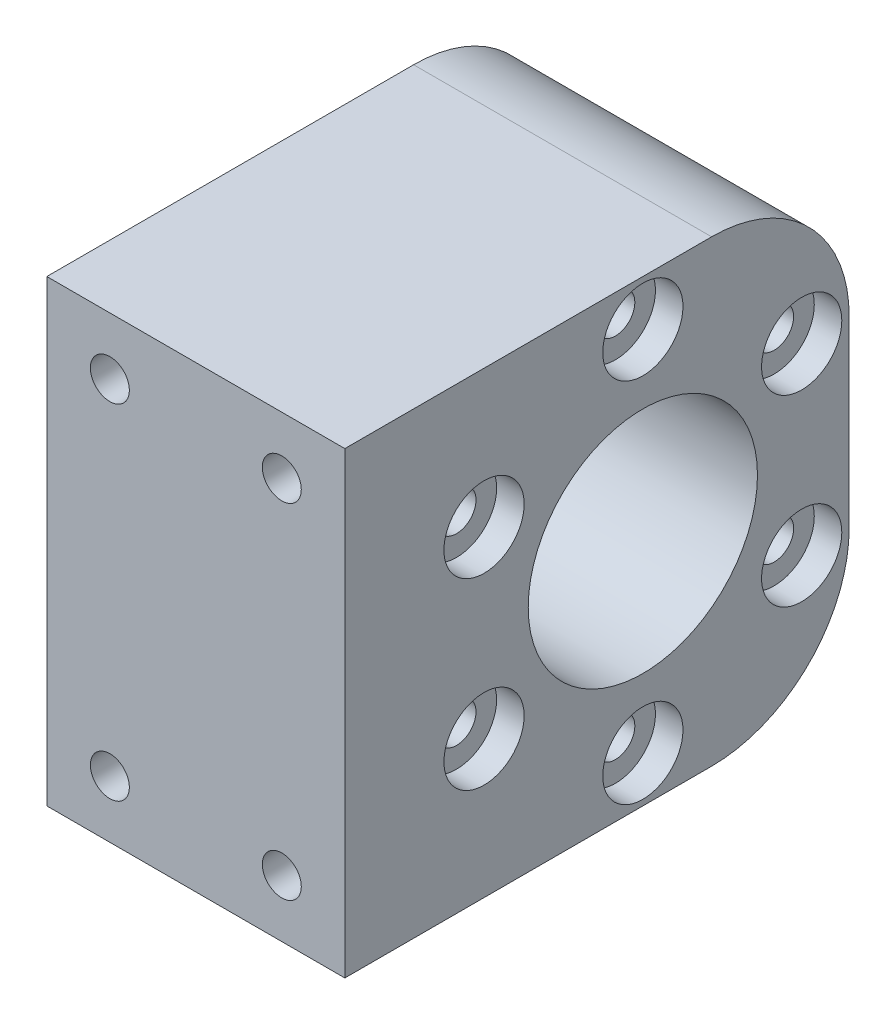
ISO-10303-21;
HEADER;
FILE_DESCRIPTION(('STEP AP214'),'2;1');
FILE_NAME('part.step','',(''),(''),'','','');
FILE_SCHEMA(('AUTOMOTIVE_DESIGN { 1 0 10303 214 1 1 1 1 }'));
ENDSEC;
DATA;
#1=APPLICATION_CONTEXT('core data for automotive mechanical design processes');
#2=APPLICATION_PROTOCOL_DEFINITION('international standard','automotive_design',2000,#1);
#3=PRODUCT_CONTEXT('',#1,'mechanical');
#4=PRODUCT('Part','Part','',(#3));
#5=PRODUCT_RELATED_PRODUCT_CATEGORY('part','',(#4));
#6=PRODUCT_DEFINITION_FORMATION('','',#4);
#7=PRODUCT_DEFINITION_CONTEXT('part definition',#1,'design');
#8=PRODUCT_DEFINITION('design','',#6,#7);
#9=PRODUCT_DEFINITION_SHAPE('','',#8);
#10=(LENGTH_UNIT() NAMED_UNIT(*) SI_UNIT(.MILLI.,.METRE.));
#11=(NAMED_UNIT(*) PLANE_ANGLE_UNIT() SI_UNIT($,.RADIAN.));
#12=(NAMED_UNIT(*) SI_UNIT($,.STERADIAN.) SOLID_ANGLE_UNIT());
#13=UNCERTAINTY_MEASURE_WITH_UNIT(LENGTH_MEASURE(1.E-05),#10,'distance_accuracy_value','');
#14=(GEOMETRIC_REPRESENTATION_CONTEXT(3) GLOBAL_UNCERTAINTY_ASSIGNED_CONTEXT((#13)) GLOBAL_UNIT_ASSIGNED_CONTEXT((#10,
#11,#12)) REPRESENTATION_CONTEXT('',''));
#15=CARTESIAN_POINT('',(0.,0.,0.));
#16=DIRECTION('',(0.,0.,1.));
#17=DIRECTION('',(1.,0.,0.));
#18=AXIS2_PLACEMENT_3D('',#15,#16,#17);
#19=CARTESIAN_POINT('',(13.,-20.,26.));
#20=DIRECTION('',(-1.,0.,0.));
#21=DIRECTION('',(0.,0.,1.));
#22=AXIS2_PLACEMENT_3D('',#19,#20,#21);
#23=PLANE('',#22);
#24=CARTESIAN_POINT('',(13.,0.,0.));
#25=DIRECTION('',(-1.,0.,0.));
#26=DIRECTION('',(0.,0.,1.));
#27=AXIS2_PLACEMENT_3D('',#24,#25,#26);
#28=CIRCLE('',#27,10.);
#29=CARTESIAN_POINT('',(13.,0.,10.));
#30=VERTEX_POINT('',#29);
#31=EDGE_CURVE('E186',#30,#30,#28,.T.);
#32=ORIENTED_EDGE('',*,*,#31,.T.);
#33=EDGE_LOOP('',(#32));
#34=FACE_BOUND('',#33,.T.);
#35=CARTESIAN_POINT('',(13.,16.,0.));
#36=DIRECTION('',(1.,0.,0.));
#37=DIRECTION('',(0.,0.,-1.));
#38=AXIS2_PLACEMENT_3D('',#35,#36,#37);
#39=CIRCLE('',#38,3.5);
#40=CARTESIAN_POINT('',(13.,16.,-3.5));
#41=VERTEX_POINT('',#40);
#42=EDGE_CURVE('E189',#41,#41,#39,.T.);
#43=ORIENTED_EDGE('',*,*,#42,.F.);
#44=EDGE_LOOP('',(#43));
#45=FACE_BOUND('',#44,.T.);
#46=CARTESIAN_POINT('',(13.,8.00000000000059,-13.8564064605514));
#47=DIRECTION('',(1.,0.,0.));
#48=DIRECTION('',(0.,0.,-1.));
#49=AXIS2_PLACEMENT_3D('',#46,#47,#48);
#50=CIRCLE('',#49,3.5);
#51=CARTESIAN_POINT('',(13.,8.00000000000059,-17.3564064605514));
#52=VERTEX_POINT('',#51);
#53=EDGE_CURVE('E203',#52,#52,#50,.T.);
#54=ORIENTED_EDGE('',*,*,#53,.F.);
#55=EDGE_LOOP('',(#54));
#56=FACE_BOUND('',#55,.T.);
#57=CARTESIAN_POINT('',(13.,-7.99999999999941,-13.856406460552));
#58=DIRECTION('',(1.,0.,0.));
#59=DIRECTION('',(0.,0.,-1.));
#60=AXIS2_PLACEMENT_3D('',#57,#58,#59);
#61=CIRCLE('',#60,3.5);
#62=CARTESIAN_POINT('',(13.,-7.99999999999941,-17.356406460552));
#63=VERTEX_POINT('',#62);
#64=EDGE_CURVE('E215',#63,#63,#61,.T.);
#65=ORIENTED_EDGE('',*,*,#64,.F.);
#66=EDGE_LOOP('',(#65));
#67=FACE_BOUND('',#66,.T.);
#68=CARTESIAN_POINT('',(13.,-16.,-1.35836374802349E-12));
#69=DIRECTION('',(1.,0.,0.));
#70=DIRECTION('',(0.,0.,-1.));
#71=AXIS2_PLACEMENT_3D('',#68,#69,#70);
#72=CIRCLE('',#71,3.5);
#73=CARTESIAN_POINT('',(13.,-16.,-3.50000000000135));
#74=VERTEX_POINT('',#73);
#75=EDGE_CURVE('E227',#74,#74,#72,.T.);
#76=ORIENTED_EDGE('',*,*,#75,.F.);
#77=EDGE_LOOP('',(#76));
#78=FACE_BOUND('',#77,.T.);
#79=CARTESIAN_POINT('',(13.,-8.0000000000006,13.85640646055));
#80=DIRECTION('',(1.,0.,0.));
#81=DIRECTION('',(0.,0.,-1.));
#82=AXIS2_PLACEMENT_3D('',#79,#80,#81);
#83=CIRCLE('',#82,3.5);
#84=CARTESIAN_POINT('',(13.,-8.0000000000006,10.35640646055));
#85=VERTEX_POINT('',#84);
#86=EDGE_CURVE('E239',#85,#85,#83,.T.);
#87=ORIENTED_EDGE('',*,*,#86,.F.);
#88=EDGE_LOOP('',(#87));
#89=FACE_BOUND('',#88,.T.);
#90=CARTESIAN_POINT('',(13.,7.99999999999941,13.8564064605507));
#91=DIRECTION('',(1.,0.,0.));
#92=DIRECTION('',(0.,0.,-1.));
#93=AXIS2_PLACEMENT_3D('',#90,#91,#92);
#94=CIRCLE('',#93,3.5);
#95=CARTESIAN_POINT('',(13.,7.99999999999941,10.3564064605507));
#96=VERTEX_POINT('',#95);
#97=EDGE_CURVE('E251',#96,#96,#94,.T.);
#98=ORIENTED_EDGE('',*,*,#97,.F.);
#99=EDGE_LOOP('',(#98));
#100=FACE_BOUND('',#99,.T.);
#101=DIRECTION('',(0.,0.,-1.));
#102=VECTOR('',#101,1.);
#103=CARTESIAN_POINT('',(13.,-20.,26.));
#104=LINE('',#103,#102);
#105=CARTESIAN_POINT('',(13.,-20.,26.));
#106=VERTEX_POINT('',#105);
#107=CARTESIAN_POINT('',(13.,-20.,-5.99999999999999));
#108=VERTEX_POINT('',#107);
#109=EDGE_CURVE('E141',#106,#108,#104,.T.);
#110=ORIENTED_EDGE('',*,*,#109,.T.);
#111=CARTESIAN_POINT('',(13.,-8.,-6.));
#112=DIRECTION('',(-1.,0.,0.));
#113=DIRECTION('',(0.,0.,1.));
#114=AXIS2_PLACEMENT_3D('',#111,#112,#113);
#115=CIRCLE('',#114,12.);
#116=CARTESIAN_POINT('',(13.,-8.,-18.));
#117=VERTEX_POINT('',#116);
#118=EDGE_CURVE('E156',#108,#117,#115,.F.);
#119=ORIENTED_EDGE('',*,*,#118,.T.);
#120=DIRECTION('',(0.,-1.,0.));
#121=VECTOR('',#120,1.);
#122=CARTESIAN_POINT('',(13.,20.,-18.));
#123=LINE('',#122,#121);
#124=CARTESIAN_POINT('',(13.,8.,-18.));
#125=VERTEX_POINT('',#124);
#126=EDGE_CURVE('E178',#125,#117,#123,.T.);
#127=ORIENTED_EDGE('',*,*,#126,.F.);
#128=CARTESIAN_POINT('',(13.,8.,-6.));
#129=DIRECTION('',(-1.,0.,0.));
#130=DIRECTION('',(0.,0.,1.));
#131=AXIS2_PLACEMENT_3D('',#128,#129,#130);
#132=CIRCLE('',#131,12.);
#133=CARTESIAN_POINT('',(13.,20.,-5.99999999999998));
#134=VERTEX_POINT('',#133);
#135=EDGE_CURVE('E154',#125,#134,#132,.F.);
#136=ORIENTED_EDGE('',*,*,#135,.T.);
#137=DIRECTION('',(0.,0.,-1.));
#138=VECTOR('',#137,1.);
#139=CARTESIAN_POINT('',(13.,20.,26.));
#140=LINE('',#139,#138);
#141=CARTESIAN_POINT('',(13.,20.,26.));
#142=VERTEX_POINT('',#141);
#143=EDGE_CURVE('E149',#142,#134,#140,.T.);
#144=ORIENTED_EDGE('',*,*,#143,.F.);
#145=DIRECTION('',(0.,1.,0.));
#146=VECTOR('',#145,1.);
#147=CARTESIAN_POINT('',(13.,-20.,26.));
#148=LINE('',#147,#146);
#149=EDGE_CURVE('E132',#106,#142,#148,.T.);
#150=ORIENTED_EDGE('',*,*,#149,.F.);
#151=EDGE_LOOP('',(#110,#119,#127,#136,#144,#150));
#152=FACE_BOUND('',#151,.T.);
#153=ADVANCED_FACE('F32',(#34,#45,#56,#67,#78,#89,#100,#152),#23,.F.);
#154=CARTESIAN_POINT('',(-13.,20.,26.));
#155=DIRECTION('',(0.,-1.,0.));
#156=DIRECTION('',(0.,0.,-1.));
#157=AXIS2_PLACEMENT_3D('',#154,#155,#156);
#158=PLANE('',#157);
#159=ORIENTED_EDGE('',*,*,#143,.T.);
#160=DIRECTION('',(1.,0.,0.));
#161=VECTOR('',#160,1.);
#162=CARTESIAN_POINT('',(-13.,20.,-5.99999999999999));
#163=LINE('',#162,#161);
#164=CARTESIAN_POINT('',(-13.,20.,-5.99999999999998));
#165=VERTEX_POINT('',#164);
#166=EDGE_CURVE('E11',#134,#165,#163,.F.);
#167=ORIENTED_EDGE('',*,*,#166,.T.);
#168=DIRECTION('',(0.,0.,-1.));
#169=VECTOR('',#168,1.);
#170=CARTESIAN_POINT('',(-13.,20.,26.));
#171=LINE('',#170,#169);
#172=CARTESIAN_POINT('',(-13.,20.,26.));
#173=VERTEX_POINT('',#172);
#174=EDGE_CURVE('E147',#173,#165,#171,.T.);
#175=ORIENTED_EDGE('',*,*,#174,.F.);
#176=DIRECTION('',(-1.,0.,0.));
#177=VECTOR('',#176,1.);
#178=CARTESIAN_POINT('',(-13.,20.,26.));
#179=LINE('',#178,#177);
#180=EDGE_CURVE('E135',#142,#173,#179,.T.);
#181=ORIENTED_EDGE('',*,*,#180,.F.);
#182=EDGE_LOOP('',(#159,#167,#175,#181));
#183=FACE_BOUND('',#182,.T.);
#184=ADVANCED_FACE('F283',(#183),#158,.F.);
#185=CARTESIAN_POINT('',(-13.,-20.,26.));
#186=DIRECTION('',(1.,0.,0.));
#187=DIRECTION('',(0.,0.,-1.));
#188=AXIS2_PLACEMENT_3D('',#185,#186,#187);
#189=PLANE('',#188);
#190=CARTESIAN_POINT('',(-13.,0.,0.));
#191=DIRECTION('',(-1.,0.,0.));
#192=DIRECTION('',(0.,0.,1.));
#193=AXIS2_PLACEMENT_3D('',#190,#191,#192);
#194=CIRCLE('',#193,10.);
#195=CARTESIAN_POINT('',(-13.,0.,10.));
#196=VERTEX_POINT('',#195);
#197=EDGE_CURVE('E183',#196,#196,#194,.T.);
#198=ORIENTED_EDGE('',*,*,#197,.F.);
#199=EDGE_LOOP('',(#198));
#200=FACE_BOUND('',#199,.T.);
#201=CARTESIAN_POINT('',(-13.,16.,0.));
#202=DIRECTION('',(1.,0.,0.));
#203=DIRECTION('',(0.,0.,-1.));
#204=AXIS2_PLACEMENT_3D('',#201,#202,#203);
#205=CIRCLE('',#204,1.69999999999999);
#206=CARTESIAN_POINT('',(-13.,16.,-1.69999999999999));
#207=VERTEX_POINT('',#206);
#208=EDGE_CURVE('E200',#207,#207,#205,.T.);
#209=ORIENTED_EDGE('',*,*,#208,.T.);
#210=EDGE_LOOP('',(#209));
#211=FACE_BOUND('',#210,.T.);
#212=CARTESIAN_POINT('',(-13.,8.00000000000059,-13.8564064605514));
#213=DIRECTION('',(1.,0.,0.));
#214=DIRECTION('',(0.,0.,-1.));
#215=AXIS2_PLACEMENT_3D('',#212,#213,#214);
#216=CIRCLE('',#215,1.69999999999999);
#217=CARTESIAN_POINT('',(-13.,8.00000000000059,-15.5564064605513));
#218=VERTEX_POINT('',#217);
#219=EDGE_CURVE('E212',#218,#218,#216,.T.);
#220=ORIENTED_EDGE('',*,*,#219,.T.);
#221=EDGE_LOOP('',(#220));
#222=FACE_BOUND('',#221,.T.);
#223=CARTESIAN_POINT('',(-13.,-7.99999999999941,-13.856406460552));
#224=DIRECTION('',(1.,0.,0.));
#225=DIRECTION('',(0.,0.,-1.));
#226=AXIS2_PLACEMENT_3D('',#223,#224,#225);
#227=CIRCLE('',#226,1.69999999999999);
#228=CARTESIAN_POINT('',(-13.,-7.99999999999941,-15.556406460552));
#229=VERTEX_POINT('',#228);
#230=EDGE_CURVE('E224',#229,#229,#227,.T.);
#231=ORIENTED_EDGE('',*,*,#230,.T.);
#232=EDGE_LOOP('',(#231));
#233=FACE_BOUND('',#232,.T.);
#234=CARTESIAN_POINT('',(-13.,-16.,-1.35836374802349E-12));
#235=DIRECTION('',(1.,0.,0.));
#236=DIRECTION('',(0.,0.,-1.));
#237=AXIS2_PLACEMENT_3D('',#234,#235,#236);
#238=CIRCLE('',#237,1.69999999999999);
#239=CARTESIAN_POINT('',(-13.,-16.,-1.70000000000135));
#240=VERTEX_POINT('',#239);
#241=EDGE_CURVE('E236',#240,#240,#238,.T.);
#242=ORIENTED_EDGE('',*,*,#241,.T.);
#243=EDGE_LOOP('',(#242));
#244=FACE_BOUND('',#243,.T.);
#245=CARTESIAN_POINT('',(-13.,-8.0000000000006,13.85640646055));
#246=DIRECTION('',(1.,0.,0.));
#247=DIRECTION('',(0.,0.,-1.));
#248=AXIS2_PLACEMENT_3D('',#245,#246,#247);
#249=CIRCLE('',#248,1.69999999999999);
#250=CARTESIAN_POINT('',(-13.,-8.0000000000006,12.15640646055));
#251=VERTEX_POINT('',#250);
#252=EDGE_CURVE('E248',#251,#251,#249,.T.);
#253=ORIENTED_EDGE('',*,*,#252,.T.);
#254=EDGE_LOOP('',(#253));
#255=FACE_BOUND('',#254,.T.);
#256=CARTESIAN_POINT('',(-13.,7.99999999999941,13.8564064605507));
#257=DIRECTION('',(1.,0.,0.));
#258=DIRECTION('',(0.,0.,-1.));
#259=AXIS2_PLACEMENT_3D('',#256,#257,#258);
#260=CIRCLE('',#259,1.69999999999999);
#261=CARTESIAN_POINT('',(-13.,7.99999999999941,12.1564064605507));
#262=VERTEX_POINT('',#261);
#263=EDGE_CURVE('E114',#262,#262,#260,.T.);
#264=ORIENTED_EDGE('',*,*,#263,.T.);
#265=EDGE_LOOP('',(#264));
#266=FACE_BOUND('',#265,.T.);
#267=DIRECTION('',(0.,-1.,0.));
#268=VECTOR('',#267,1.);
#269=CARTESIAN_POINT('',(-13.,20.,-18.));
#270=LINE('',#269,#268);
#271=CARTESIAN_POINT('',(-13.,8.,-18.));
#272=VERTEX_POINT('',#271);
#273=CARTESIAN_POINT('',(-13.,-8.,-18.));
#274=VERTEX_POINT('',#273);
#275=EDGE_CURVE('E169',#272,#274,#270,.T.);
#276=ORIENTED_EDGE('',*,*,#275,.T.);
#277=CARTESIAN_POINT('',(-13.,-8.,-6.));
#278=DIRECTION('',(1.,0.,0.));
#279=DIRECTION('',(0.,0.,-1.));
#280=AXIS2_PLACEMENT_3D('',#277,#278,#279);
#281=CIRCLE('',#280,12.);
#282=CARTESIAN_POINT('',(-13.,-20.,-5.99999999999999));
#283=VERTEX_POINT('',#282);
#284=EDGE_CURVE('E40',#274,#283,#281,.F.);
#285=ORIENTED_EDGE('',*,*,#284,.T.);
#286=DIRECTION('',(0.,0.,-1.));
#287=VECTOR('',#286,1.);
#288=CARTESIAN_POINT('',(-13.,-20.,26.));
#289=LINE('',#288,#287);
#290=CARTESIAN_POINT('',(-13.,-20.,26.));
#291=VERTEX_POINT('',#290);
#292=EDGE_CURVE('E144',#291,#283,#289,.T.);
#293=ORIENTED_EDGE('',*,*,#292,.F.);
#294=DIRECTION('',(0.,-1.,0.));
#295=VECTOR('',#294,1.);
#296=CARTESIAN_POINT('',(-13.,-20.,26.));
#297=LINE('',#296,#295);
#298=EDGE_CURVE('E137',#173,#291,#297,.T.);
#299=ORIENTED_EDGE('',*,*,#298,.F.);
#300=ORIENTED_EDGE('',*,*,#174,.T.);
#301=CARTESIAN_POINT('',(-13.,8.,-6.));
#302=DIRECTION('',(1.,0.,0.));
#303=DIRECTION('',(0.,0.,-1.));
#304=AXIS2_PLACEMENT_3D('',#301,#302,#303);
#305=CIRCLE('',#304,12.);
#306=EDGE_CURVE('E162',#165,#272,#305,.F.);
#307=ORIENTED_EDGE('',*,*,#306,.T.);
#308=EDGE_LOOP('',(#276,#285,#293,#299,#300,#307));
#309=FACE_BOUND('',#308,.T.);
#310=ADVANCED_FACE('F166',(#200,#211,#222,#233,#244,#255,#266,#309),#189,.F.);
#311=CARTESIAN_POINT('',(-13.,-20.,26.));
#312=DIRECTION('',(0.,1.,0.));
#313=DIRECTION('',(0.,0.,1.));
#314=AXIS2_PLACEMENT_3D('',#311,#312,#313);
#315=PLANE('',#314);
#316=ORIENTED_EDGE('',*,*,#292,.T.);
#317=DIRECTION('',(1.,0.,0.));
#318=VECTOR('',#317,1.);
#319=CARTESIAN_POINT('',(-13.,-20.,-6.));
#320=LINE('',#319,#318);
#321=EDGE_CURVE('E151',#283,#108,#320,.T.);
#322=ORIENTED_EDGE('',*,*,#321,.T.);
#323=ORIENTED_EDGE('',*,*,#109,.F.);
#324=DIRECTION('',(1.,0.,0.));
#325=VECTOR('',#324,1.);
#326=CARTESIAN_POINT('',(-13.,-20.,26.));
#327=LINE('',#326,#325);
#328=EDGE_CURVE('E139',#291,#106,#327,.T.);
#329=ORIENTED_EDGE('',*,*,#328,.F.);
#330=EDGE_LOOP('',(#316,#322,#323,#329));
#331=FACE_BOUND('',#330,.T.);
#332=ADVANCED_FACE('F173',(#331),#315,.F.);
#333=CARTESIAN_POINT('',(0.,0.,26.));
#334=DIRECTION('',(0.,0.,-1.));
#335=DIRECTION('',(-1.,0.,0.));
#336=AXIS2_PLACEMENT_3D('',#333,#334,#335);
#337=PLANE('',#336);
#338=CARTESIAN_POINT('',(-7.5,15.,26.));
#339=DIRECTION('',(0.,0.,1.));
#340=DIRECTION('',(1.,0.,0.));
#341=AXIS2_PLACEMENT_3D('',#338,#339,#340);
#342=CIRCLE('',#341,1.69999999999999);
#343=CARTESIAN_POINT('',(-5.80000000000001,15.,26.));
#344=VERTEX_POINT('',#343);
#345=EDGE_CURVE('E108',#344,#344,#342,.T.);
#346=ORIENTED_EDGE('',*,*,#345,.F.);
#347=EDGE_LOOP('',(#346));
#348=FACE_BOUND('',#347,.T.);
#349=CARTESIAN_POINT('',(7.5,-15.,26.));
#350=DIRECTION('',(0.,0.,1.));
#351=DIRECTION('',(1.,0.,0.));
#352=AXIS2_PLACEMENT_3D('',#349,#350,#351);
#353=CIRCLE('',#352,1.69999999999999);
#354=CARTESIAN_POINT('',(9.19999999999999,-15.,26.));
#355=VERTEX_POINT('',#354);
#356=EDGE_CURVE('E107',#355,#355,#353,.T.);
#357=ORIENTED_EDGE('',*,*,#356,.F.);
#358=EDGE_LOOP('',(#357));
#359=FACE_BOUND('',#358,.T.);
#360=CARTESIAN_POINT('',(7.5,15.,26.));
#361=DIRECTION('',(0.,0.,1.));
#362=DIRECTION('',(1.,0.,0.));
#363=AXIS2_PLACEMENT_3D('',#360,#361,#362);
#364=CIRCLE('',#363,1.69999999999999);
#365=CARTESIAN_POINT('',(9.19999999999999,15.,26.));
#366=VERTEX_POINT('',#365);
#367=EDGE_CURVE('E120',#366,#366,#364,.T.);
#368=ORIENTED_EDGE('',*,*,#367,.F.);
#369=EDGE_LOOP('',(#368));
#370=FACE_BOUND('',#369,.T.);
#371=CARTESIAN_POINT('',(-7.5,-15.,26.));
#372=DIRECTION('',(0.,0.,1.));
#373=DIRECTION('',(1.,0.,0.));
#374=AXIS2_PLACEMENT_3D('',#371,#372,#373);
#375=CIRCLE('',#374,1.69999999999999);
#376=CARTESIAN_POINT('',(-5.80000000000001,-15.,26.));
#377=VERTEX_POINT('',#376);
#378=EDGE_CURVE('E126',#377,#377,#375,.T.);
#379=ORIENTED_EDGE('',*,*,#378,.F.);
#380=EDGE_LOOP('',(#379));
#381=FACE_BOUND('',#380,.T.);
#382=ORIENTED_EDGE('',*,*,#149,.T.);
#383=ORIENTED_EDGE('',*,*,#180,.T.);
#384=ORIENTED_EDGE('',*,*,#298,.T.);
#385=ORIENTED_EDGE('',*,*,#328,.T.);
#386=EDGE_LOOP('',(#382,#383,#384,#385));
#387=FACE_BOUND('',#386,.T.);
#388=ADVANCED_FACE('F389',(#348,#359,#370,#381,#387),#337,.F.);
#389=CARTESIAN_POINT('',(-7.5,-15.,11.));
#390=DIRECTION('',(0.,0.,1.));
#391=DIRECTION('',(1.,0.,0.));
#392=AXIS2_PLACEMENT_3D('',#389,#390,#391);
#393=CONICAL_SURFACE('',#392,1.7,1.02974425867665);
#394=CARTESIAN_POINT('',(-7.5,-15.,9.97853694765314));
#395=VERTEX_POINT('',#394);
#396=VERTEX_LOOP('',#395);
#397=FACE_BOUND('',#396,.T.);
#398=CARTESIAN_POINT('',(-7.5,-15.,11.));
#399=DIRECTION('',(0.,0.,1.));
#400=DIRECTION('',(1.,0.,0.));
#401=AXIS2_PLACEMENT_3D('',#398,#399,#400);
#402=CIRCLE('',#401,1.7);
#403=CARTESIAN_POINT('',(-5.8,-15.,11.));
#404=VERTEX_POINT('',#403);
#405=EDGE_CURVE('E129',#404,#404,#402,.T.);
#406=ORIENTED_EDGE('',*,*,#405,.T.);
#407=EDGE_LOOP('',(#406));
#408=FACE_BOUND('',#407,.T.);
#409=ADVANCED_FACE('F385',(#397,#408),#393,.F.);
#410=CARTESIAN_POINT('',(-7.5,-15.,26.));
#411=DIRECTION('',(0.,0.,1.));
#412=DIRECTION('',(1.,0.,0.));
#413=AXIS2_PLACEMENT_3D('',#410,#411,#412);
#414=CYLINDRICAL_SURFACE('',#413,1.69999999999999);
#415=ORIENTED_EDGE('',*,*,#405,.F.);
#416=EDGE_LOOP('',(#415));
#417=FACE_BOUND('',#416,.T.);
#418=ORIENTED_EDGE('',*,*,#378,.T.);
#419=EDGE_LOOP('',(#418));
#420=FACE_BOUND('',#419,.T.);
#421=ADVANCED_FACE('F381',(#417,#420),#414,.F.);
#422=CARTESIAN_POINT('',(7.5,15.,11.));
#423=DIRECTION('',(0.,0.,1.));
#424=DIRECTION('',(1.,0.,0.));
#425=AXIS2_PLACEMENT_3D('',#422,#423,#424);
#426=CONICAL_SURFACE('',#425,1.7,1.02974425867665);
#427=CARTESIAN_POINT('',(7.5,15.,9.97853694765314));
#428=VERTEX_POINT('',#427);
#429=VERTEX_LOOP('',#428);
#430=FACE_BOUND('',#429,.T.);
#431=CARTESIAN_POINT('',(7.5,15.,11.));
#432=DIRECTION('',(0.,0.,1.));
#433=DIRECTION('',(1.,0.,0.));
#434=AXIS2_PLACEMENT_3D('',#431,#432,#433);
#435=CIRCLE('',#434,1.7);
#436=CARTESIAN_POINT('',(9.2,15.,11.));
#437=VERTEX_POINT('',#436);
#438=EDGE_CURVE('E123',#437,#437,#435,.T.);
#439=ORIENTED_EDGE('',*,*,#438,.T.);
#440=EDGE_LOOP('',(#439));
#441=FACE_BOUND('',#440,.T.);
#442=ADVANCED_FACE('F377',(#430,#441),#426,.F.);
#443=CARTESIAN_POINT('',(7.5,15.,26.));
#444=DIRECTION('',(0.,0.,1.));
#445=DIRECTION('',(1.,0.,0.));
#446=AXIS2_PLACEMENT_3D('',#443,#444,#445);
#447=CYLINDRICAL_SURFACE('',#446,1.69999999999999);
#448=ORIENTED_EDGE('',*,*,#438,.F.);
#449=EDGE_LOOP('',(#448));
#450=FACE_BOUND('',#449,.T.);
#451=ORIENTED_EDGE('',*,*,#367,.T.);
#452=EDGE_LOOP('',(#451));
#453=FACE_BOUND('',#452,.T.);
#454=ADVANCED_FACE('F373',(#450,#453),#447,.F.);
#455=CARTESIAN_POINT('',(7.5,-15.,11.));
#456=DIRECTION('',(0.,0.,1.));
#457=DIRECTION('',(1.,0.,0.));
#458=AXIS2_PLACEMENT_3D('',#455,#456,#457);
#459=CONICAL_SURFACE('',#458,1.7,1.02974425867665);
#460=CARTESIAN_POINT('',(7.5,-15.,9.97853694765314));
#461=VERTEX_POINT('',#460);
#462=VERTEX_LOOP('',#461);
#463=FACE_BOUND('',#462,.T.);
#464=CARTESIAN_POINT('',(7.5,-15.,11.));
#465=DIRECTION('',(0.,0.,1.));
#466=DIRECTION('',(1.,0.,0.));
#467=AXIS2_PLACEMENT_3D('',#464,#465,#466);
#468=CIRCLE('',#467,1.7);
#469=CARTESIAN_POINT('',(9.2,-15.,11.));
#470=VERTEX_POINT('',#469);
#471=EDGE_CURVE('E111',#470,#470,#468,.T.);
#472=ORIENTED_EDGE('',*,*,#471,.T.);
#473=EDGE_LOOP('',(#472));
#474=FACE_BOUND('',#473,.T.);
#475=ADVANCED_FACE('F369',(#463,#474),#459,.F.);
#476=CARTESIAN_POINT('',(7.5,-15.,26.));
#477=DIRECTION('',(0.,0.,1.));
#478=DIRECTION('',(1.,0.,0.));
#479=AXIS2_PLACEMENT_3D('',#476,#477,#478);
#480=CYLINDRICAL_SURFACE('',#479,1.69999999999999);
#481=ORIENTED_EDGE('',*,*,#471,.F.);
#482=EDGE_LOOP('',(#481));
#483=FACE_BOUND('',#482,.T.);
#484=ORIENTED_EDGE('',*,*,#356,.T.);
#485=EDGE_LOOP('',(#484));
#486=FACE_BOUND('',#485,.T.);
#487=ADVANCED_FACE('F101',(#483,#486),#480,.F.);
#488=CARTESIAN_POINT('',(-7.5,15.,11.));
#489=DIRECTION('',(0.,0.,1.));
#490=DIRECTION('',(1.,0.,0.));
#491=AXIS2_PLACEMENT_3D('',#488,#489,#490);
#492=CONICAL_SURFACE('',#491,1.7,1.02974425867665);
#493=CARTESIAN_POINT('',(-7.5,15.,9.97853694765314));
#494=VERTEX_POINT('',#493);
#495=VERTEX_LOOP('',#494);
#496=FACE_BOUND('',#495,.T.);
#497=CARTESIAN_POINT('',(-7.5,15.,11.));
#498=DIRECTION('',(0.,0.,1.));
#499=DIRECTION('',(1.,0.,0.));
#500=AXIS2_PLACEMENT_3D('',#497,#498,#499);
#501=CIRCLE('',#500,1.7);
#502=CARTESIAN_POINT('',(-5.8,15.,11.));
#503=VERTEX_POINT('',#502);
#504=EDGE_CURVE('E105',#503,#503,#501,.T.);
#505=ORIENTED_EDGE('',*,*,#504,.T.);
#506=EDGE_LOOP('',(#505));
#507=FACE_BOUND('',#506,.T.);
#508=ADVANCED_FACE('F97',(#496,#507),#492,.F.);
#509=CARTESIAN_POINT('',(-7.5,15.,26.));
#510=DIRECTION('',(0.,0.,1.));
#511=DIRECTION('',(1.,0.,0.));
#512=AXIS2_PLACEMENT_3D('',#509,#510,#511);
#513=CYLINDRICAL_SURFACE('',#512,1.69999999999999);
#514=ORIENTED_EDGE('',*,*,#504,.F.);
#515=EDGE_LOOP('',(#514));
#516=FACE_BOUND('',#515,.T.);
#517=ORIENTED_EDGE('',*,*,#345,.T.);
#518=EDGE_LOOP('',(#517));
#519=FACE_BOUND('',#518,.T.);
#520=ADVANCED_FACE('F100',(#516,#519),#513,.F.);
#521=CARTESIAN_POINT('',(13.,7.99999999999941,13.8564064605507));
#522=DIRECTION('',(1.,0.,0.));
#523=DIRECTION('',(0.,0.,-1.));
#524=AXIS2_PLACEMENT_3D('',#521,#522,#523);
#525=CYLINDRICAL_SURFACE('',#524,1.7);
#526=ORIENTED_EDGE('',*,*,#263,.F.);
#527=EDGE_LOOP('',(#526));
#528=FACE_BOUND('',#527,.T.);
#529=CARTESIAN_POINT('',(10.6,7.99999999999941,13.8564064605507));
#530=DIRECTION('',(1.,0.,0.));
#531=DIRECTION('',(0.,0.,-1.));
#532=AXIS2_PLACEMENT_3D('',#529,#530,#531);
#533=CIRCLE('',#532,1.70000000000001);
#534=CARTESIAN_POINT('',(10.6,7.99999999999941,12.1564064605507));
#535=VERTEX_POINT('',#534);
#536=EDGE_CURVE('E257',#535,#535,#533,.T.);
#537=ORIENTED_EDGE('',*,*,#536,.T.);
#538=EDGE_LOOP('',(#537));
#539=FACE_BOUND('',#538,.T.);
#540=ADVANCED_FACE('F263',(#528,#539),#525,.F.);
#541=CARTESIAN_POINT('',(10.6,9.69999999999943,13.8564064605507));
#542=DIRECTION('',(-1.,0.,0.));
#543=DIRECTION('',(0.,0.,1.));
#544=AXIS2_PLACEMENT_3D('',#541,#542,#543);
#545=PLANE('',#544);
#546=ORIENTED_EDGE('',*,*,#536,.F.);
#547=EDGE_LOOP('',(#546));
#548=FACE_BOUND('',#547,.T.);
#549=CARTESIAN_POINT('',(10.6,7.99999999999941,13.8564064605507));
#550=DIRECTION('',(1.,0.,0.));
#551=DIRECTION('',(0.,0.,-1.));
#552=AXIS2_PLACEMENT_3D('',#549,#550,#551);
#553=CIRCLE('',#552,3.5);
#554=CARTESIAN_POINT('',(10.6,7.99999999999941,10.3564064605507));
#555=VERTEX_POINT('',#554);
#556=EDGE_CURVE('E254',#555,#555,#553,.T.);
#557=ORIENTED_EDGE('',*,*,#556,.T.);
#558=EDGE_LOOP('',(#557));
#559=FACE_BOUND('',#558,.T.);
#560=ADVANCED_FACE('F266',(#548,#559),#545,.F.);
#561=CARTESIAN_POINT('',(13.,7.99999999999941,13.8564064605507));
#562=DIRECTION('',(1.,0.,0.));
#563=DIRECTION('',(0.,0.,-1.));
#564=AXIS2_PLACEMENT_3D('',#561,#562,#563);
#565=CYLINDRICAL_SURFACE('',#564,3.5);
#566=ORIENTED_EDGE('',*,*,#556,.F.);
#567=EDGE_LOOP('',(#566));
#568=FACE_BOUND('',#567,.T.);
#569=ORIENTED_EDGE('',*,*,#97,.T.);
#570=EDGE_LOOP('',(#569));
#571=FACE_BOUND('',#570,.T.);
#572=ADVANCED_FACE('F272',(#568,#571),#565,.F.);
#573=CARTESIAN_POINT('',(13.,-8.0000000000006,13.85640646055));
#574=DIRECTION('',(1.,0.,0.));
#575=DIRECTION('',(0.,0.,-1.));
#576=AXIS2_PLACEMENT_3D('',#573,#574,#575);
#577=CYLINDRICAL_SURFACE('',#576,1.7);
#578=ORIENTED_EDGE('',*,*,#252,.F.);
#579=EDGE_LOOP('',(#578));
#580=FACE_BOUND('',#579,.T.);
#581=CARTESIAN_POINT('',(10.6,-8.0000000000006,13.85640646055));
#582=DIRECTION('',(1.,0.,0.));
#583=DIRECTION('',(0.,0.,-1.));
#584=AXIS2_PLACEMENT_3D('',#581,#582,#583);
#585=CIRCLE('',#584,1.70000000000001);
#586=CARTESIAN_POINT('',(10.6,-8.0000000000006,12.15640646055));
#587=VERTEX_POINT('',#586);
#588=EDGE_CURVE('E245',#587,#587,#585,.T.);
#589=ORIENTED_EDGE('',*,*,#588,.T.);
#590=EDGE_LOOP('',(#589));
#591=FACE_BOUND('',#590,.T.);
#592=ADVANCED_FACE('F278',(#580,#591),#577,.F.);
#593=CARTESIAN_POINT('',(10.6,-6.30000000000058,13.85640646055));
#594=DIRECTION('',(-1.,0.,0.));
#595=DIRECTION('',(0.,0.,1.));
#596=AXIS2_PLACEMENT_3D('',#593,#594,#595);
#597=PLANE('',#596);
#598=ORIENTED_EDGE('',*,*,#588,.F.);
#599=EDGE_LOOP('',(#598));
#600=FACE_BOUND('',#599,.T.);
#601=CARTESIAN_POINT('',(10.6,-8.0000000000006,13.85640646055));
#602=DIRECTION('',(1.,0.,0.));
#603=DIRECTION('',(0.,0.,-1.));
#604=AXIS2_PLACEMENT_3D('',#601,#602,#603);
#605=CIRCLE('',#604,3.5);
#606=CARTESIAN_POINT('',(10.6,-8.0000000000006,10.35640646055));
#607=VERTEX_POINT('',#606);
#608=EDGE_CURVE('E242',#607,#607,#605,.T.);
#609=ORIENTED_EDGE('',*,*,#608,.T.);
#610=EDGE_LOOP('',(#609));
#611=FACE_BOUND('',#610,.T.);
#612=ADVANCED_FACE('F357',(#600,#611),#597,.F.);
#613=CARTESIAN_POINT('',(13.,-8.0000000000006,13.85640646055));
#614=DIRECTION('',(1.,0.,0.));
#615=DIRECTION('',(0.,0.,-1.));
#616=AXIS2_PLACEMENT_3D('',#613,#614,#615);
#617=CYLINDRICAL_SURFACE('',#616,3.5);
#618=ORIENTED_EDGE('',*,*,#608,.F.);
#619=EDGE_LOOP('',(#618));
#620=FACE_BOUND('',#619,.T.);
#621=ORIENTED_EDGE('',*,*,#86,.T.);
#622=EDGE_LOOP('',(#621));
#623=FACE_BOUND('',#622,.T.);
#624=ADVANCED_FACE('F353',(#620,#623),#617,.F.);
#625=CARTESIAN_POINT('',(13.,-16.,-1.35836374802349E-12));
#626=DIRECTION('',(1.,0.,0.));
#627=DIRECTION('',(0.,0.,-1.));
#628=AXIS2_PLACEMENT_3D('',#625,#626,#627);
#629=CYLINDRICAL_SURFACE('',#628,1.7);
#630=ORIENTED_EDGE('',*,*,#241,.F.);
#631=EDGE_LOOP('',(#630));
#632=FACE_BOUND('',#631,.T.);
#633=CARTESIAN_POINT('',(10.6,-16.,-1.35836374802349E-12));
#634=DIRECTION('',(1.,0.,0.));
#635=DIRECTION('',(0.,0.,-1.));
#636=AXIS2_PLACEMENT_3D('',#633,#634,#635);
#637=CIRCLE('',#636,1.70000000000001);
#638=CARTESIAN_POINT('',(10.6,-16.,-1.70000000000137));
#639=VERTEX_POINT('',#638);
#640=EDGE_CURVE('E233',#639,#639,#637,.T.);
#641=ORIENTED_EDGE('',*,*,#640,.T.);
#642=EDGE_LOOP('',(#641));
#643=FACE_BOUND('',#642,.T.);
#644=ADVANCED_FACE('F349',(#632,#643),#629,.F.);
#645=CARTESIAN_POINT('',(10.6,-14.3,-1.35836374802349E-12));
#646=DIRECTION('',(-1.,0.,0.));
#647=DIRECTION('',(0.,0.,1.));
#648=AXIS2_PLACEMENT_3D('',#645,#646,#647);
#649=PLANE('',#648);
#650=ORIENTED_EDGE('',*,*,#640,.F.);
#651=EDGE_LOOP('',(#650));
#652=FACE_BOUND('',#651,.T.);
#653=CARTESIAN_POINT('',(10.6,-16.,-1.35836374802349E-12));
#654=DIRECTION('',(1.,0.,0.));
#655=DIRECTION('',(0.,0.,-1.));
#656=AXIS2_PLACEMENT_3D('',#653,#654,#655);
#657=CIRCLE('',#656,3.5);
#658=CARTESIAN_POINT('',(10.6,-16.,-3.50000000000135));
#659=VERTEX_POINT('',#658);
#660=EDGE_CURVE('E230',#659,#659,#657,.T.);
#661=ORIENTED_EDGE('',*,*,#660,.T.);
#662=EDGE_LOOP('',(#661));
#663=FACE_BOUND('',#662,.T.);
#664=ADVANCED_FACE('F345',(#652,#663),#649,.F.);
#665=CARTESIAN_POINT('',(13.,-16.,-1.35836374802349E-12));
#666=DIRECTION('',(1.,0.,0.));
#667=DIRECTION('',(0.,0.,-1.));
#668=AXIS2_PLACEMENT_3D('',#665,#666,#667);
#669=CYLINDRICAL_SURFACE('',#668,3.5);
#670=ORIENTED_EDGE('',*,*,#660,.F.);
#671=EDGE_LOOP('',(#670));
#672=FACE_BOUND('',#671,.T.);
#673=ORIENTED_EDGE('',*,*,#75,.T.);
#674=EDGE_LOOP('',(#673));
#675=FACE_BOUND('',#674,.T.);
#676=ADVANCED_FACE('F341',(#672,#675),#669,.F.);
#677=CARTESIAN_POINT('',(13.,-7.99999999999941,-13.856406460552));
#678=DIRECTION('',(1.,0.,0.));
#679=DIRECTION('',(0.,0.,-1.));
#680=AXIS2_PLACEMENT_3D('',#677,#678,#679);
#681=CYLINDRICAL_SURFACE('',#680,1.7);
#682=ORIENTED_EDGE('',*,*,#230,.F.);
#683=EDGE_LOOP('',(#682));
#684=FACE_BOUND('',#683,.T.);
#685=CARTESIAN_POINT('',(10.6,-7.99999999999941,-13.856406460552));
#686=DIRECTION('',(1.,0.,0.));
#687=DIRECTION('',(0.,0.,-1.));
#688=AXIS2_PLACEMENT_3D('',#685,#686,#687);
#689=CIRCLE('',#688,1.70000000000001);
#690=CARTESIAN_POINT('',(10.6,-7.99999999999941,-15.556406460552));
#691=VERTEX_POINT('',#690);
#692=EDGE_CURVE('E221',#691,#691,#689,.T.);
#693=ORIENTED_EDGE('',*,*,#692,.T.);
#694=EDGE_LOOP('',(#693));
#695=FACE_BOUND('',#694,.T.);
#696=ADVANCED_FACE('F337',(#684,#695),#681,.F.);
#697=CARTESIAN_POINT('',(10.6,-6.2999999999994,-13.856406460552));
#698=DIRECTION('',(-1.,0.,0.));
#699=DIRECTION('',(0.,0.,1.));
#700=AXIS2_PLACEMENT_3D('',#697,#698,#699);
#701=PLANE('',#700);
#702=ORIENTED_EDGE('',*,*,#692,.F.);
#703=EDGE_LOOP('',(#702));
#704=FACE_BOUND('',#703,.T.);
#705=CARTESIAN_POINT('',(10.6,-7.99999999999941,-13.856406460552));
#706=DIRECTION('',(1.,0.,0.));
#707=DIRECTION('',(0.,0.,-1.));
#708=AXIS2_PLACEMENT_3D('',#705,#706,#707);
#709=CIRCLE('',#708,3.5);
#710=CARTESIAN_POINT('',(10.6,-7.99999999999941,-17.356406460552));
#711=VERTEX_POINT('',#710);
#712=EDGE_CURVE('E218',#711,#711,#709,.T.);
#713=ORIENTED_EDGE('',*,*,#712,.T.);
#714=EDGE_LOOP('',(#713));
#715=FACE_BOUND('',#714,.T.);
#716=ADVANCED_FACE('F333',(#704,#715),#701,.F.);
#717=CARTESIAN_POINT('',(13.,-7.99999999999941,-13.856406460552));
#718=DIRECTION('',(1.,0.,0.));
#719=DIRECTION('',(0.,0.,-1.));
#720=AXIS2_PLACEMENT_3D('',#717,#718,#719);
#721=CYLINDRICAL_SURFACE('',#720,3.5);
#722=ORIENTED_EDGE('',*,*,#712,.F.);
#723=EDGE_LOOP('',(#722));
#724=FACE_BOUND('',#723,.T.);
#725=ORIENTED_EDGE('',*,*,#64,.T.);
#726=EDGE_LOOP('',(#725));
#727=FACE_BOUND('',#726,.T.);
#728=ADVANCED_FACE('F329',(#724,#727),#721,.F.);
#729=CARTESIAN_POINT('',(13.,8.00000000000059,-13.8564064605514));
#730=DIRECTION('',(1.,0.,0.));
#731=DIRECTION('',(0.,0.,-1.));
#732=AXIS2_PLACEMENT_3D('',#729,#730,#731);
#733=CYLINDRICAL_SURFACE('',#732,1.7);
#734=ORIENTED_EDGE('',*,*,#219,.F.);
#735=EDGE_LOOP('',(#734));
#736=FACE_BOUND('',#735,.T.);
#737=CARTESIAN_POINT('',(10.6,8.00000000000059,-13.8564064605514));
#738=DIRECTION('',(1.,0.,0.));
#739=DIRECTION('',(0.,0.,-1.));
#740=AXIS2_PLACEMENT_3D('',#737,#738,#739);
#741=CIRCLE('',#740,1.70000000000001);
#742=CARTESIAN_POINT('',(10.6,8.00000000000059,-15.5564064605514));
#743=VERTEX_POINT('',#742);
#744=EDGE_CURVE('E209',#743,#743,#741,.T.);
#745=ORIENTED_EDGE('',*,*,#744,.T.);
#746=EDGE_LOOP('',(#745));
#747=FACE_BOUND('',#746,.T.);
#748=ADVANCED_FACE('F325',(#736,#747),#733,.F.);
#749=CARTESIAN_POINT('',(10.6,9.7000000000006,-13.8564064605514));
#750=DIRECTION('',(-1.,0.,0.));
#751=DIRECTION('',(0.,0.,1.));
#752=AXIS2_PLACEMENT_3D('',#749,#750,#751);
#753=PLANE('',#752);
#754=ORIENTED_EDGE('',*,*,#744,.F.);
#755=EDGE_LOOP('',(#754));
#756=FACE_BOUND('',#755,.T.);
#757=CARTESIAN_POINT('',(10.6,8.00000000000059,-13.8564064605514));
#758=DIRECTION('',(1.,0.,0.));
#759=DIRECTION('',(0.,0.,-1.));
#760=AXIS2_PLACEMENT_3D('',#757,#758,#759);
#761=CIRCLE('',#760,3.5);
#762=CARTESIAN_POINT('',(10.6,8.00000000000059,-17.3564064605514));
#763=VERTEX_POINT('',#762);
#764=EDGE_CURVE('E206',#763,#763,#761,.T.);
#765=ORIENTED_EDGE('',*,*,#764,.T.);
#766=EDGE_LOOP('',(#765));
#767=FACE_BOUND('',#766,.T.);
#768=ADVANCED_FACE('F321',(#756,#767),#753,.F.);
#769=CARTESIAN_POINT('',(13.,8.00000000000059,-13.8564064605514));
#770=DIRECTION('',(1.,0.,0.));
#771=DIRECTION('',(0.,0.,-1.));
#772=AXIS2_PLACEMENT_3D('',#769,#770,#771);
#773=CYLINDRICAL_SURFACE('',#772,3.5);
#774=ORIENTED_EDGE('',*,*,#764,.F.);
#775=EDGE_LOOP('',(#774));
#776=FACE_BOUND('',#775,.T.);
#777=ORIENTED_EDGE('',*,*,#53,.T.);
#778=EDGE_LOOP('',(#777));
#779=FACE_BOUND('',#778,.T.);
#780=ADVANCED_FACE('F317',(#776,#779),#773,.F.);
#781=CARTESIAN_POINT('',(13.,16.,0.));
#782=DIRECTION('',(1.,0.,0.));
#783=DIRECTION('',(0.,0.,-1.));
#784=AXIS2_PLACEMENT_3D('',#781,#782,#783);
#785=CYLINDRICAL_SURFACE('',#784,1.7);
#786=ORIENTED_EDGE('',*,*,#208,.F.);
#787=EDGE_LOOP('',(#786));
#788=FACE_BOUND('',#787,.T.);
#789=CARTESIAN_POINT('',(10.6,16.,0.));
#790=DIRECTION('',(1.,0.,0.));
#791=DIRECTION('',(0.,0.,-1.));
#792=AXIS2_PLACEMENT_3D('',#789,#790,#791);
#793=CIRCLE('',#792,1.70000000000001);
#794=CARTESIAN_POINT('',(10.6,16.,-1.70000000000001));
#795=VERTEX_POINT('',#794);
#796=EDGE_CURVE('E197',#795,#795,#793,.T.);
#797=ORIENTED_EDGE('',*,*,#796,.T.);
#798=EDGE_LOOP('',(#797));
#799=FACE_BOUND('',#798,.T.);
#800=ADVANCED_FACE('F313',(#788,#799),#785,.F.);
#801=CARTESIAN_POINT('',(10.6,17.7,0.));
#802=DIRECTION('',(-1.,0.,0.));
#803=DIRECTION('',(0.,0.,1.));
#804=AXIS2_PLACEMENT_3D('',#801,#802,#803);
#805=PLANE('',#804);
#806=ORIENTED_EDGE('',*,*,#796,.F.);
#807=EDGE_LOOP('',(#806));
#808=FACE_BOUND('',#807,.T.);
#809=CARTESIAN_POINT('',(10.6,16.,0.));
#810=DIRECTION('',(1.,0.,0.));
#811=DIRECTION('',(0.,0.,-1.));
#812=AXIS2_PLACEMENT_3D('',#809,#810,#811);
#813=CIRCLE('',#812,3.5);
#814=CARTESIAN_POINT('',(10.6,16.,-3.5));
#815=VERTEX_POINT('',#814);
#816=EDGE_CURVE('E194',#815,#815,#813,.T.);
#817=ORIENTED_EDGE('',*,*,#816,.T.);
#818=EDGE_LOOP('',(#817));
#819=FACE_BOUND('',#818,.T.);
#820=ADVANCED_FACE('F309',(#808,#819),#805,.F.);
#821=CARTESIAN_POINT('',(13.,16.,0.));
#822=DIRECTION('',(1.,0.,0.));
#823=DIRECTION('',(0.,0.,-1.));
#824=AXIS2_PLACEMENT_3D('',#821,#822,#823);
#825=CYLINDRICAL_SURFACE('',#824,3.5);
#826=ORIENTED_EDGE('',*,*,#816,.F.);
#827=EDGE_LOOP('',(#826));
#828=FACE_BOUND('',#827,.T.);
#829=ORIENTED_EDGE('',*,*,#42,.T.);
#830=EDGE_LOOP('',(#829));
#831=FACE_BOUND('',#830,.T.);
#832=ADVANCED_FACE('F303',(#828,#831),#825,.F.);
#833=CARTESIAN_POINT('',(13.,0.,0.));
#834=DIRECTION('',(-1.,0.,0.));
#835=DIRECTION('',(0.,0.,1.));
#836=AXIS2_PLACEMENT_3D('',#833,#834,#835);
#837=CYLINDRICAL_SURFACE('',#836,10.);
#838=CARTESIAN_POINT('',(13.,0.,10.));
#839=CARTESIAN_POINT('',(12.7291666666667,0.,10.));
#840=CARTESIAN_POINT('',(12.4583333333333,0.,10.));
#841=CARTESIAN_POINT('',(11.9166666666667,0.,10.));
#842=CARTESIAN_POINT('',(11.6458333333333,0.,10.));
#843=CARTESIAN_POINT('',(11.1041666666667,0.,10.));
#844=CARTESIAN_POINT('',(10.8333333333333,0.,10.));
#845=CARTESIAN_POINT('',(10.2916666666667,0.,10.));
#846=CARTESIAN_POINT('',(10.0208333333333,0.,10.));
#847=CARTESIAN_POINT('',(9.47916666666667,0.,10.));
#848=CARTESIAN_POINT('',(9.20833333333333,0.,10.));
#849=CARTESIAN_POINT('',(8.66666666666667,0.,10.));
#850=CARTESIAN_POINT('',(8.39583333333333,0.,10.));
#851=CARTESIAN_POINT('',(7.85416666666667,0.,10.));
#852=CARTESIAN_POINT('',(7.58333333333333,0.,10.));
#853=CARTESIAN_POINT('',(7.04166666666667,0.,10.));
#854=CARTESIAN_POINT('',(6.77083333333333,0.,10.));
#855=CARTESIAN_POINT('',(6.22916666666667,0.,10.));
#856=CARTESIAN_POINT('',(5.95833333333333,0.,10.));
#857=CARTESIAN_POINT('',(5.41666666666667,0.,10.));
#858=CARTESIAN_POINT('',(5.14583333333334,0.,10.));
#859=CARTESIAN_POINT('',(4.60416666666667,0.,10.));
#860=CARTESIAN_POINT('',(4.33333333333334,0.,10.));
#861=CARTESIAN_POINT('',(3.79166666666667,0.,10.));
#862=CARTESIAN_POINT('',(3.52083333333333,0.,10.));
#863=CARTESIAN_POINT('',(2.97916666666667,0.,10.));
#864=CARTESIAN_POINT('',(2.70833333333334,0.,10.));
#865=CARTESIAN_POINT('',(2.16666666666667,0.,10.));
#866=CARTESIAN_POINT('',(1.89583333333334,0.,10.));
#867=CARTESIAN_POINT('',(1.35416666666667,0.,10.));
#868=CARTESIAN_POINT('',(1.08333333333334,0.,10.));
#869=CARTESIAN_POINT('',(0.541666666666669,0.,10.));
#870=CARTESIAN_POINT('',(0.270833333333335,0.,10.));
#871=CARTESIAN_POINT('',(-0.270833333333332,0.,10.));
#872=CARTESIAN_POINT('',(-0.541666666666665,0.,10.));
#873=CARTESIAN_POINT('',(-1.08333333333333,0.,10.));
#874=CARTESIAN_POINT('',(-1.35416666666666,0.,10.));
#875=CARTESIAN_POINT('',(-1.89583333333333,0.,10.));
#876=CARTESIAN_POINT('',(-2.16666666666667,0.,10.));
#877=CARTESIAN_POINT('',(-2.70833333333333,0.,10.));
#878=CARTESIAN_POINT('',(-2.97916666666666,0.,10.));
#879=CARTESIAN_POINT('',(-3.52083333333333,0.,10.));
#880=CARTESIAN_POINT('',(-3.79166666666667,0.,10.));
#881=CARTESIAN_POINT('',(-4.33333333333333,0.,10.));
#882=CARTESIAN_POINT('',(-4.60416666666667,0.,10.));
#883=CARTESIAN_POINT('',(-5.14583333333333,0.,10.));
#884=CARTESIAN_POINT('',(-5.41666666666667,0.,10.));
#885=CARTESIAN_POINT('',(-5.95833333333333,0.,10.));
#886=CARTESIAN_POINT('',(-6.22916666666667,0.,10.));
#887=CARTESIAN_POINT('',(-6.77083333333333,0.,10.));
#888=CARTESIAN_POINT('',(-7.04166666666667,0.,10.));
#889=CARTESIAN_POINT('',(-7.58333333333333,0.,10.));
#890=CARTESIAN_POINT('',(-7.85416666666667,0.,10.));
#891=CARTESIAN_POINT('',(-8.39583333333333,0.,10.));
#892=CARTESIAN_POINT('',(-8.66666666666667,0.,10.));
#893=CARTESIAN_POINT('',(-9.20833333333333,0.,10.));
#894=CARTESIAN_POINT('',(-9.47916666666667,0.,10.));
#895=CARTESIAN_POINT('',(-10.0208333333333,0.,10.));
#896=CARTESIAN_POINT('',(-10.2916666666667,0.,10.));
#897=CARTESIAN_POINT('',(-10.8333333333333,0.,10.));
#898=CARTESIAN_POINT('',(-11.1041666666667,0.,10.));
#899=CARTESIAN_POINT('',(-11.6458333333333,0.,10.));
#900=CARTESIAN_POINT('',(-11.9166666666667,0.,10.));
#901=CARTESIAN_POINT('',(-12.4583333333333,0.,10.));
#902=CARTESIAN_POINT('',(-12.7291666666667,0.,10.));
#903=CARTESIAN_POINT('',(-13.,0.,10.));
#904=B_SPLINE_CURVE_WITH_KNOTS('',3,(#838,#839,#840,#841,#842,#843,#844,#845,#846,#847,#848,
#849,#850,#851,#852,#853,#854,#855,#856,#857,#858,#859,#860,#861,#862,#863,#864,#865,#866,#867,
#868,#869,#870,#871,#872,#873,#874,#875,#876,#877,#878,#879,#880,#881,#882,#883,#884,#885,#886,
#887,#888,#889,#890,#891,#892,#893,#894,#895,#896,#897,#898,#899,#900,#901,#902,#903),
.UNSPECIFIED.,.F.,.F.,(4,2,2,2,2,2,2,2,2,2,2,2,2,2,2,2,2,2,2,2,2,2,2,2,2,2,2,2,2,2,2,2,4),(0.,
0.812500000000001,1.625,2.4375,3.25,4.0625,4.875,5.6875,6.5,7.3125,8.125,8.9375,9.75,10.5625,
11.375,12.1875,13.,13.8125,14.625,15.4375,16.25,17.0625,17.875,18.6875,19.5,20.3125,21.125,
21.9375,22.75,23.5625,24.375,25.1875,26.),.UNSPECIFIED.);
#905=EDGE_CURVE('BSEAM298',#30,#196,#904,.T.);
#906=ORIENTED_EDGE('',*,*,#31,.F.);
#907=ORIENTED_EDGE('',*,*,#197,.T.);
#908=ORIENTED_EDGE('',*,*,#905,.T.);
#909=ORIENTED_EDGE('',*,*,#905,.F.);
#910=EDGE_LOOP('',(#906,#908,#907,#909));
#911=FACE_BOUND('',#910,.T.);
#912=ADVANCED_FACE('F298',(#911),#837,.F.);
#913=CARTESIAN_POINT('',(-13.,20.,-18.));
#914=DIRECTION('',(0.,0.,1.));
#915=DIRECTION('',(0.,-1.,0.));
#916=AXIS2_PLACEMENT_3D('',#913,#914,#915);
#917=PLANE('',#916);
#918=ORIENTED_EDGE('',*,*,#126,.T.);
#919=DIRECTION('',(1.,0.,0.));
#920=VECTOR('',#919,1.);
#921=CARTESIAN_POINT('',(-13.,-8.,-18.));
#922=LINE('',#921,#920);
#923=EDGE_CURVE('E53',#117,#274,#922,.F.);
#924=ORIENTED_EDGE('',*,*,#923,.T.);
#925=ORIENTED_EDGE('',*,*,#275,.F.);
#926=DIRECTION('',(1.,0.,0.));
#927=VECTOR('',#926,1.);
#928=CARTESIAN_POINT('',(-13.,8.,-18.));
#929=LINE('',#928,#927);
#930=EDGE_CURVE('E158',#272,#125,#929,.T.);
#931=ORIENTED_EDGE('',*,*,#930,.T.);
#932=EDGE_LOOP('',(#918,#924,#925,#931));
#933=FACE_BOUND('',#932,.T.);
#934=ADVANCED_FACE('F180',(#933),#917,.F.);
#935=CARTESIAN_POINT('',(-13.,-8.,-6.));
#936=DIRECTION('',(1.,0.,0.));
#937=DIRECTION('',(0.,0.,-1.));
#938=AXIS2_PLACEMENT_3D('',#935,#936,#937);
#939=CYLINDRICAL_SURFACE('',#938,12.);
#940=ORIENTED_EDGE('',*,*,#284,.F.);
#941=ORIENTED_EDGE('',*,*,#923,.F.);
#942=ORIENTED_EDGE('',*,*,#118,.F.);
#943=ORIENTED_EDGE('',*,*,#321,.F.);
#944=EDGE_LOOP('',(#940,#941,#942,#943));
#945=FACE_BOUND('',#944,.T.);
#946=ADVANCED_FACE('F175',(#945),#939,.T.);
#947=CARTESIAN_POINT('',(-13.,8.,-6.));
#948=DIRECTION('',(1.,0.,0.));
#949=DIRECTION('',(0.,0.,-1.));
#950=AXIS2_PLACEMENT_3D('',#947,#948,#949);
#951=CYLINDRICAL_SURFACE('',#950,12.);
#952=ORIENTED_EDGE('',*,*,#306,.F.);
#953=ORIENTED_EDGE('',*,*,#166,.F.);
#954=ORIENTED_EDGE('',*,*,#135,.F.);
#955=ORIENTED_EDGE('',*,*,#930,.F.);
#956=EDGE_LOOP('',(#952,#953,#954,#955));
#957=FACE_BOUND('',#956,.T.);
#958=ADVANCED_FACE('F34',(#957),#951,.T.);
#959=CLOSED_SHELL('',(#153,#184,#310,#332,#388,#409,#421,#442,#454,#475,#487,#508,#520,#540,
#560,#572,#592,#612,#624,#644,#664,#676,#696,#716,#728,#748,#768,#780,#800,#820,#832,#912,#934,
#946,#958));
#960=MANIFOLD_SOLID_BREP('B2',#959);
#961=ADVANCED_BREP_SHAPE_REPRESENTATION('',(#18,#960),#14);
#962=SHAPE_DEFINITION_REPRESENTATION(#9,#961);
ENDSEC;
END-ISO-10303-21;
